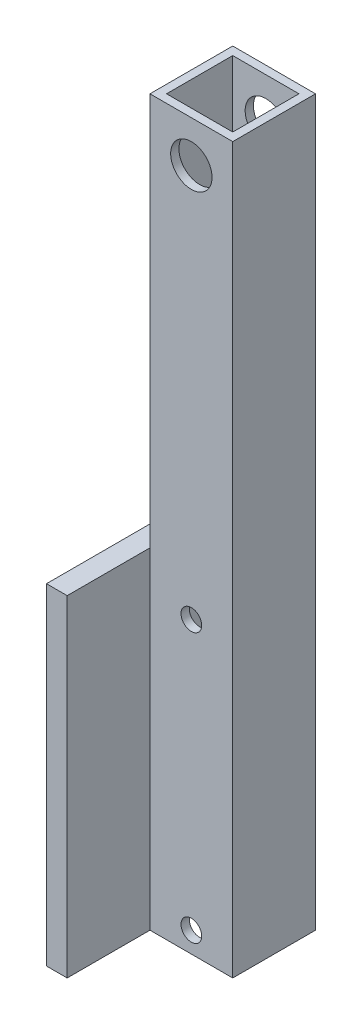
ISO-10303-21;
HEADER;
FILE_DESCRIPTION(('STEP AP214'),'2;1');
FILE_NAME('part.step','',(''),(''),'','','');
FILE_SCHEMA(('AUTOMOTIVE_DESIGN { 1 0 10303 214 1 1 1 1 }'));
ENDSEC;
DATA;
#1=APPLICATION_CONTEXT('core data for automotive mechanical design processes');
#2=APPLICATION_PROTOCOL_DEFINITION('international standard','automotive_design',2000,#1);
#3=PRODUCT_CONTEXT('',#1,'mechanical');
#4=PRODUCT('Part','Part','',(#3));
#5=PRODUCT_RELATED_PRODUCT_CATEGORY('part','',(#4));
#6=PRODUCT_DEFINITION_FORMATION('','',#4);
#7=PRODUCT_DEFINITION_CONTEXT('part definition',#1,'design');
#8=PRODUCT_DEFINITION('design','',#6,#7);
#9=PRODUCT_DEFINITION_SHAPE('','',#8);
#10=(LENGTH_UNIT() NAMED_UNIT(*) SI_UNIT(.MILLI.,.METRE.));
#11=(NAMED_UNIT(*) PLANE_ANGLE_UNIT() SI_UNIT($,.RADIAN.));
#12=(NAMED_UNIT(*) SI_UNIT($,.STERADIAN.) SOLID_ANGLE_UNIT());
#13=UNCERTAINTY_MEASURE_WITH_UNIT(LENGTH_MEASURE(1.E-05),#10,'distance_accuracy_value','');
#14=(GEOMETRIC_REPRESENTATION_CONTEXT(3) GLOBAL_UNCERTAINTY_ASSIGNED_CONTEXT((#13)) GLOBAL_UNIT_ASSIGNED_CONTEXT((#10,
#11,#12)) REPRESENTATION_CONTEXT('',''));
#15=CARTESIAN_POINT('',(0.,0.,0.));
#16=DIRECTION('',(0.,0.,1.));
#17=DIRECTION('',(1.,0.,0.));
#18=AXIS2_PLACEMENT_3D('',#15,#16,#17);
#19=CARTESIAN_POINT('',(-12.7,222.25,-12.7));
#20=DIRECTION('',(1.,0.,0.));
#21=DIRECTION('',(0.,0.,-1.));
#22=AXIS2_PLACEMENT_3D('',#19,#20,#21);
#23=PLANE('',#22);
#24=DIRECTION('',(0.,0.,-1.));
#25=VECTOR('',#24,1.);
#26=CARTESIAN_POINT('',(-12.7,101.6,-38.1));
#27=LINE('',#26,#25);
#28=CARTESIAN_POINT('',(-12.7,101.6,12.7));
#29=VERTEX_POINT('',#28);
#30=CARTESIAN_POINT('',(-12.7,101.6,-12.7));
#31=VERTEX_POINT('',#30);
#32=EDGE_CURVE('E11',#29,#31,#27,.T.);
#33=ORIENTED_EDGE('',*,*,#32,.F.);
#34=DIRECTION('',(0.,-1.,0.));
#35=VECTOR('',#34,1.);
#36=CARTESIAN_POINT('',(-12.7,222.25,12.7));
#37=LINE('',#36,#35);
#38=CARTESIAN_POINT('',(-12.7,222.25,12.7));
#39=VERTEX_POINT('',#38);
#40=EDGE_CURVE('E255',#39,#29,#37,.T.);
#41=ORIENTED_EDGE('',*,*,#40,.F.);
#42=DIRECTION('',(0.,0.,1.));
#43=VECTOR('',#42,1.);
#44=CARTESIAN_POINT('',(-12.7,222.25,-12.7));
#45=LINE('',#44,#43);
#46=CARTESIAN_POINT('',(-12.7,222.25,-12.7));
#47=VERTEX_POINT('',#46);
#48=EDGE_CURVE('E242',#47,#39,#45,.T.);
#49=ORIENTED_EDGE('',*,*,#48,.F.);
#50=DIRECTION('',(0.,-1.,0.));
#51=VECTOR('',#50,1.);
#52=CARTESIAN_POINT('',(-12.7,222.25,-12.7));
#53=LINE('',#52,#51);
#54=EDGE_CURVE('E258',#47,#31,#53,.T.);
#55=ORIENTED_EDGE('',*,*,#54,.T.);
#56=EDGE_LOOP('',(#33,#41,#49,#55));
#57=FACE_BOUND('',#56,.T.);
#58=ADVANCED_FACE('F47',(#57),#23,.F.);
#59=CARTESIAN_POINT('',(0.,222.25,0.));
#60=DIRECTION('',(0.,1.,0.));
#61=DIRECTION('',(0.,0.,1.));
#62=AXIS2_PLACEMENT_3D('',#59,#60,#61);
#63=PLANE('',#62);
#64=DIRECTION('',(0.,0.,-1.));
#65=VECTOR('',#64,1.);
#66=CARTESIAN_POINT('',(12.7,222.25,-12.7));
#67=LINE('',#66,#65);
#68=CARTESIAN_POINT('',(12.7,222.25,12.7));
#69=VERTEX_POINT('',#68);
#70=CARTESIAN_POINT('',(12.7,222.25,-12.7));
#71=VERTEX_POINT('',#70);
#72=EDGE_CURVE('E236',#69,#71,#67,.T.);
#73=ORIENTED_EDGE('',*,*,#72,.T.);
#74=DIRECTION('',(-1.,0.,0.));
#75=VECTOR('',#74,1.);
#76=CARTESIAN_POINT('',(-12.7,222.25,-12.7));
#77=LINE('',#76,#75);
#78=EDGE_CURVE('E239',#71,#47,#77,.T.);
#79=ORIENTED_EDGE('',*,*,#78,.T.);
#80=ORIENTED_EDGE('',*,*,#48,.T.);
#81=DIRECTION('',(1.,0.,0.));
#82=VECTOR('',#81,1.);
#83=CARTESIAN_POINT('',(-12.7,222.25,12.7));
#84=LINE('',#83,#82);
#85=EDGE_CURVE('E244',#39,#69,#84,.T.);
#86=ORIENTED_EDGE('',*,*,#85,.T.);
#87=EDGE_LOOP('',(#73,#79,#80,#86));
#88=FACE_BOUND('',#87,.T.);
#89=DIRECTION('',(1.,0.,0.));
#90=VECTOR('',#89,1.);
#91=CARTESIAN_POINT('',(-10.16,222.25,10.16));
#92=LINE('',#91,#90);
#93=CARTESIAN_POINT('',(-10.16,222.25,10.16));
#94=VERTEX_POINT('',#93);
#95=CARTESIAN_POINT('',(10.16,222.25,10.16));
#96=VERTEX_POINT('',#95);
#97=EDGE_CURVE('E209',#94,#96,#92,.T.);
#98=ORIENTED_EDGE('',*,*,#97,.F.);
#99=DIRECTION('',(0.,0.,1.));
#100=VECTOR('',#99,1.);
#101=CARTESIAN_POINT('',(-10.16,222.25,-10.16));
#102=LINE('',#101,#100);
#103=CARTESIAN_POINT('',(-10.16,222.25,-10.16));
#104=VERTEX_POINT('',#103);
#105=EDGE_CURVE('E207',#104,#94,#102,.T.);
#106=ORIENTED_EDGE('',*,*,#105,.F.);
#107=DIRECTION('',(-1.,0.,0.));
#108=VECTOR('',#107,1.);
#109=CARTESIAN_POINT('',(-10.16,222.25,-10.16));
#110=LINE('',#109,#108);
#111=CARTESIAN_POINT('',(10.16,222.25,-10.16));
#112=VERTEX_POINT('',#111);
#113=EDGE_CURVE('E214',#112,#104,#110,.T.);
#114=ORIENTED_EDGE('',*,*,#113,.F.);
#115=DIRECTION('',(0.,0.,-1.));
#116=VECTOR('',#115,1.);
#117=CARTESIAN_POINT('',(10.16,222.25,-10.16));
#118=LINE('',#117,#116);
#119=EDGE_CURVE('E212',#96,#112,#118,.T.);
#120=ORIENTED_EDGE('',*,*,#119,.F.);
#121=EDGE_LOOP('',(#98,#106,#114,#120));
#122=FACE_BOUND('',#121,.T.);
#123=ADVANCED_FACE('F286',(#88,#122),#63,.T.);
#124=CARTESIAN_POINT('',(0.,0.,0.));
#125=DIRECTION('',(0.,1.,0.));
#126=DIRECTION('',(0.,0.,1.));
#127=AXIS2_PLACEMENT_3D('',#124,#125,#126);
#128=PLANE('',#127);
#129=DIRECTION('',(0.,0.,-1.));
#130=VECTOR('',#129,1.);
#131=CARTESIAN_POINT('',(12.7,0.,-12.7));
#132=LINE('',#131,#130);
#133=CARTESIAN_POINT('',(12.7,0.,12.7));
#134=VERTEX_POINT('',#133);
#135=CARTESIAN_POINT('',(12.7,0.,-12.7));
#136=VERTEX_POINT('',#135);
#137=EDGE_CURVE('E235',#134,#136,#132,.T.);
#138=ORIENTED_EDGE('',*,*,#137,.F.);
#139=DIRECTION('',(1.,0.,0.));
#140=VECTOR('',#139,1.);
#141=CARTESIAN_POINT('',(-12.7,0.,12.7));
#142=LINE('',#141,#140);
#143=CARTESIAN_POINT('',(-12.7,0.,12.7));
#144=VERTEX_POINT('',#143);
#145=EDGE_CURVE('E240',#144,#134,#142,.T.);
#146=ORIENTED_EDGE('',*,*,#145,.F.);
#147=DIRECTION('',(0.,0.,1.));
#148=VECTOR('',#147,1.);
#149=CARTESIAN_POINT('',(-12.7,0.,-38.1));
#150=LINE('',#149,#148);
#151=CARTESIAN_POINT('',(-12.7,0.,38.1));
#152=VERTEX_POINT('',#151);
#153=EDGE_CURVE('E340',#144,#152,#150,.T.);
#154=ORIENTED_EDGE('',*,*,#153,.T.);
#155=DIRECTION('',(1.,0.,0.));
#156=VECTOR('',#155,1.);
#157=CARTESIAN_POINT('',(-19.05,0.,38.1));
#158=LINE('',#157,#156);
#159=CARTESIAN_POINT('',(-19.05,0.,38.1));
#160=VERTEX_POINT('',#159);
#161=EDGE_CURVE('E155',#160,#152,#158,.T.);
#162=ORIENTED_EDGE('',*,*,#161,.F.);
#163=DIRECTION('',(0.,0.,1.));
#164=VECTOR('',#163,1.);
#165=CARTESIAN_POINT('',(-19.05,0.,-38.1));
#166=LINE('',#165,#164);
#167=CARTESIAN_POINT('',(-19.05,0.,-38.1));
#168=VERTEX_POINT('',#167);
#169=EDGE_CURVE('E145',#168,#160,#166,.T.);
#170=ORIENTED_EDGE('',*,*,#169,.F.);
#171=DIRECTION('',(1.,0.,0.));
#172=VECTOR('',#171,1.);
#173=CARTESIAN_POINT('',(-19.05,0.,-38.1));
#174=LINE('',#173,#172);
#175=CARTESIAN_POINT('',(-12.7,0.,-38.1));
#176=VERTEX_POINT('',#175);
#177=EDGE_CURVE('E152',#168,#176,#174,.T.);
#178=ORIENTED_EDGE('',*,*,#177,.T.);
#179=CARTESIAN_POINT('',(-12.7,0.,-12.7));
#180=VERTEX_POINT('',#179);
#181=EDGE_CURVE('E338',#176,#180,#150,.T.);
#182=ORIENTED_EDGE('',*,*,#181,.T.);
#183=DIRECTION('',(-1.,0.,0.));
#184=VECTOR('',#183,1.);
#185=CARTESIAN_POINT('',(-12.7,0.,-12.7));
#186=LINE('',#185,#184);
#187=EDGE_CURVE('E249',#136,#180,#186,.T.);
#188=ORIENTED_EDGE('',*,*,#187,.F.);
#189=EDGE_LOOP('',(#138,#146,#154,#162,#170,#178,#182,#188));
#190=FACE_BOUND('',#189,.T.);
#191=DIRECTION('',(0.,0.,1.));
#192=VECTOR('',#191,1.);
#193=CARTESIAN_POINT('',(-10.16,0.,-10.16));
#194=LINE('',#193,#192);
#195=CARTESIAN_POINT('',(-10.16,0.,-10.16));
#196=VERTEX_POINT('',#195);
#197=CARTESIAN_POINT('',(-10.16,0.,10.16));
#198=VERTEX_POINT('',#197);
#199=EDGE_CURVE('E206',#196,#198,#194,.T.);
#200=ORIENTED_EDGE('',*,*,#199,.T.);
#201=DIRECTION('',(1.,0.,0.));
#202=VECTOR('',#201,1.);
#203=CARTESIAN_POINT('',(-10.16,0.,10.16));
#204=LINE('',#203,#202);
#205=CARTESIAN_POINT('',(10.16,0.,10.16));
#206=VERTEX_POINT('',#205);
#207=EDGE_CURVE('E219',#198,#206,#204,.T.);
#208=ORIENTED_EDGE('',*,*,#207,.T.);
#209=DIRECTION('',(0.,0.,-1.));
#210=VECTOR('',#209,1.);
#211=CARTESIAN_POINT('',(10.16,0.,-10.16));
#212=LINE('',#211,#210);
#213=CARTESIAN_POINT('',(10.16,0.,-10.16));
#214=VERTEX_POINT('',#213);
#215=EDGE_CURVE('E222',#206,#214,#212,.T.);
#216=ORIENTED_EDGE('',*,*,#215,.T.);
#217=DIRECTION('',(-1.,0.,0.));
#218=VECTOR('',#217,1.);
#219=CARTESIAN_POINT('',(-10.16,0.,-10.16));
#220=LINE('',#219,#218);
#221=EDGE_CURVE('E210',#214,#196,#220,.T.);
#222=ORIENTED_EDGE('',*,*,#221,.T.);
#223=EDGE_LOOP('',(#200,#208,#216,#222));
#224=FACE_BOUND('',#223,.T.);
#225=ADVANCED_FACE('F148',(#190,#224),#128,.F.);
#226=CARTESIAN_POINT('',(12.7,222.25,-12.7));
#227=DIRECTION('',(-1.,0.,0.));
#228=DIRECTION('',(0.,0.,1.));
#229=AXIS2_PLACEMENT_3D('',#226,#227,#228);
#230=PLANE('',#229);
#231=ORIENTED_EDGE('',*,*,#137,.T.);
#232=DIRECTION('',(0.,-1.,0.));
#233=VECTOR('',#232,1.);
#234=CARTESIAN_POINT('',(12.7,222.25,-12.7));
#235=LINE('',#234,#233);
#236=EDGE_CURVE('E56',#71,#136,#235,.T.);
#237=ORIENTED_EDGE('',*,*,#236,.F.);
#238=ORIENTED_EDGE('',*,*,#72,.F.);
#239=DIRECTION('',(0.,-1.,0.));
#240=VECTOR('',#239,1.);
#241=CARTESIAN_POINT('',(12.7,222.25,12.7));
#242=LINE('',#241,#240);
#243=EDGE_CURVE('E246',#69,#134,#242,.T.);
#244=ORIENTED_EDGE('',*,*,#243,.T.);
#245=EDGE_LOOP('',(#231,#237,#238,#244));
#246=FACE_BOUND('',#245,.T.);
#247=ADVANCED_FACE('F49',(#246),#230,.F.);
#248=CARTESIAN_POINT('',(-12.7,222.25,-12.7));
#249=DIRECTION('',(0.,0.,1.));
#250=DIRECTION('',(1.,0.,0.));
#251=AXIS2_PLACEMENT_3D('',#248,#249,#250);
#252=PLANE('',#251);
#253=CARTESIAN_POINT('',(0.,209.55,-12.7));
#254=DIRECTION('',(0.,0.,1.));
#255=DIRECTION('',(1.,0.,0.));
#256=AXIS2_PLACEMENT_3D('',#253,#254,#255);
#257=CIRCLE('',#256,6.35);
#258=CARTESIAN_POINT('',(6.35,209.55,-12.7));
#259=VERTEX_POINT('',#258);
#260=EDGE_CURVE('E203',#259,#259,#257,.T.);
#261=ORIENTED_EDGE('',*,*,#260,.T.);
#262=EDGE_LOOP('',(#261));
#263=FACE_BOUND('',#262,.T.);
#264=CARTESIAN_POINT('',(0.,6.34999999999999,-12.7));
#265=DIRECTION('',(0.,0.,1.));
#266=DIRECTION('',(1.,0.,0.));
#267=AXIS2_PLACEMENT_3D('',#264,#265,#266);
#268=CIRCLE('',#267,3.175);
#269=CARTESIAN_POINT('',(3.17500000000003,6.34999999999999,-12.7));
#270=VERTEX_POINT('',#269);
#271=EDGE_CURVE('E197',#270,#270,#268,.T.);
#272=ORIENTED_EDGE('',*,*,#271,.T.);
#273=EDGE_LOOP('',(#272));
#274=FACE_BOUND('',#273,.T.);
#275=CARTESIAN_POINT('',(0.,88.9,-12.7));
#276=DIRECTION('',(0.,0.,1.));
#277=DIRECTION('',(1.,0.,0.));
#278=AXIS2_PLACEMENT_3D('',#275,#276,#277);
#279=CIRCLE('',#278,3.175);
#280=CARTESIAN_POINT('',(3.17500000000002,88.9,-12.7));
#281=VERTEX_POINT('',#280);
#282=EDGE_CURVE('E190',#281,#281,#279,.T.);
#283=ORIENTED_EDGE('',*,*,#282,.T.);
#284=EDGE_LOOP('',(#283));
#285=FACE_BOUND('',#284,.T.);
#286=ORIENTED_EDGE('',*,*,#187,.T.);
#287=EDGE_CURVE('E257',#31,#180,#53,.T.);
#288=ORIENTED_EDGE('',*,*,#287,.F.);
#289=ORIENTED_EDGE('',*,*,#54,.F.);
#290=ORIENTED_EDGE('',*,*,#78,.F.);
#291=ORIENTED_EDGE('',*,*,#236,.T.);
#292=EDGE_LOOP('',(#286,#288,#289,#290,#291));
#293=FACE_BOUND('',#292,.T.);
#294=ADVANCED_FACE('F315',(#263,#274,#285,#293),#252,.F.);
#295=CARTESIAN_POINT('',(-12.7,222.25,12.7));
#296=DIRECTION('',(0.,0.,-1.));
#297=DIRECTION('',(-1.,0.,0.));
#298=AXIS2_PLACEMENT_3D('',#295,#296,#297);
#299=PLANE('',#298);
#300=CARTESIAN_POINT('',(0.,209.55,12.7));
#301=DIRECTION('',(0.,0.,1.));
#302=DIRECTION('',(1.,0.,0.));
#303=AXIS2_PLACEMENT_3D('',#300,#301,#302);
#304=CIRCLE('',#303,6.35);
#305=CARTESIAN_POINT('',(6.35,209.55,12.7));
#306=VERTEX_POINT('',#305);
#307=EDGE_CURVE('E181',#306,#306,#304,.T.);
#308=ORIENTED_EDGE('',*,*,#307,.F.);
#309=EDGE_LOOP('',(#308));
#310=FACE_BOUND('',#309,.T.);
#311=CARTESIAN_POINT('',(0.,6.34999999999999,12.7));
#312=DIRECTION('',(0.,0.,1.));
#313=DIRECTION('',(1.,0.,0.));
#314=AXIS2_PLACEMENT_3D('',#311,#312,#313);
#315=CIRCLE('',#314,3.175);
#316=CARTESIAN_POINT('',(3.17500000000003,6.34999999999999,12.7));
#317=VERTEX_POINT('',#316);
#318=EDGE_CURVE('E175',#317,#317,#315,.T.);
#319=ORIENTED_EDGE('',*,*,#318,.F.);
#320=EDGE_LOOP('',(#319));
#321=FACE_BOUND('',#320,.T.);
#322=CARTESIAN_POINT('',(0.,88.9,12.7));
#323=DIRECTION('',(0.,0.,1.));
#324=DIRECTION('',(1.,0.,0.));
#325=AXIS2_PLACEMENT_3D('',#322,#323,#324);
#326=CIRCLE('',#325,3.175);
#327=CARTESIAN_POINT('',(3.17500000000002,88.9,12.7));
#328=VERTEX_POINT('',#327);
#329=EDGE_CURVE('E172',#328,#328,#326,.T.);
#330=ORIENTED_EDGE('',*,*,#329,.F.);
#331=EDGE_LOOP('',(#330));
#332=FACE_BOUND('',#331,.T.);
#333=ORIENTED_EDGE('',*,*,#145,.T.);
#334=ORIENTED_EDGE('',*,*,#243,.F.);
#335=ORIENTED_EDGE('',*,*,#85,.F.);
#336=ORIENTED_EDGE('',*,*,#40,.T.);
#337=EDGE_CURVE('E254',#29,#144,#37,.T.);
#338=ORIENTED_EDGE('',*,*,#337,.T.);
#339=EDGE_LOOP('',(#333,#334,#335,#336,#338));
#340=FACE_BOUND('',#339,.T.);
#341=ADVANCED_FACE('F300',(#310,#321,#332,#340),#299,.F.);
#342=CARTESIAN_POINT('',(-10.16,222.25,-10.16));
#343=DIRECTION('',(1.,0.,0.));
#344=DIRECTION('',(0.,0.,-1.));
#345=AXIS2_PLACEMENT_3D('',#342,#343,#344);
#346=PLANE('',#345);
#347=ORIENTED_EDGE('',*,*,#199,.F.);
#348=DIRECTION('',(0.,-1.,0.));
#349=VECTOR('',#348,1.);
#350=CARTESIAN_POINT('',(-10.16,222.25,-10.16));
#351=LINE('',#350,#349);
#352=EDGE_CURVE('E216',#104,#196,#351,.T.);
#353=ORIENTED_EDGE('',*,*,#352,.F.);
#354=ORIENTED_EDGE('',*,*,#105,.T.);
#355=DIRECTION('',(0.,-1.,0.));
#356=VECTOR('',#355,1.);
#357=CARTESIAN_POINT('',(-10.16,222.25,10.16));
#358=LINE('',#357,#356);
#359=EDGE_CURVE('E232',#94,#198,#358,.T.);
#360=ORIENTED_EDGE('',*,*,#359,.T.);
#361=EDGE_LOOP('',(#347,#353,#354,#360));
#362=FACE_BOUND('',#361,.T.);
#363=ADVANCED_FACE('F288',(#362),#346,.T.);
#364=CARTESIAN_POINT('',(-10.16,222.25,10.16));
#365=DIRECTION('',(0.,0.,-1.));
#366=DIRECTION('',(-1.,0.,0.));
#367=AXIS2_PLACEMENT_3D('',#364,#365,#366);
#368=PLANE('',#367);
#369=CARTESIAN_POINT('',(0.,209.55,10.16));
#370=DIRECTION('',(0.,0.,-1.));
#371=DIRECTION('',(-1.,0.,0.));
#372=AXIS2_PLACEMENT_3D('',#369,#370,#371);
#373=CIRCLE('',#372,6.35);
#374=CARTESIAN_POINT('',(-6.35,209.55,10.16));
#375=VERTEX_POINT('',#374);
#376=EDGE_CURVE('E200',#375,#375,#373,.T.);
#377=ORIENTED_EDGE('',*,*,#376,.F.);
#378=EDGE_LOOP('',(#377));
#379=FACE_BOUND('',#378,.T.);
#380=CARTESIAN_POINT('',(0.,6.34999999999999,10.16));
#381=DIRECTION('',(0.,0.,-1.));
#382=DIRECTION('',(-1.,0.,0.));
#383=AXIS2_PLACEMENT_3D('',#380,#381,#382);
#384=CIRCLE('',#383,3.175);
#385=CARTESIAN_POINT('',(-3.17499999999997,6.34999999999999,10.16));
#386=VERTEX_POINT('',#385);
#387=EDGE_CURVE('E194',#386,#386,#384,.T.);
#388=ORIENTED_EDGE('',*,*,#387,.F.);
#389=EDGE_LOOP('',(#388));
#390=FACE_BOUND('',#389,.T.);
#391=CARTESIAN_POINT('',(0.,88.9,10.16));
#392=DIRECTION('',(0.,0.,-1.));
#393=DIRECTION('',(-1.,0.,0.));
#394=AXIS2_PLACEMENT_3D('',#391,#392,#393);
#395=CIRCLE('',#394,3.175);
#396=CARTESIAN_POINT('',(-3.17499999999998,88.9,10.16));
#397=VERTEX_POINT('',#396);
#398=EDGE_CURVE('E187',#397,#397,#395,.T.);
#399=ORIENTED_EDGE('',*,*,#398,.F.);
#400=EDGE_LOOP('',(#399));
#401=FACE_BOUND('',#400,.T.);
#402=ORIENTED_EDGE('',*,*,#207,.F.);
#403=ORIENTED_EDGE('',*,*,#359,.F.);
#404=ORIENTED_EDGE('',*,*,#97,.T.);
#405=DIRECTION('',(0.,-1.,0.));
#406=VECTOR('',#405,1.);
#407=CARTESIAN_POINT('',(10.16,222.25,10.16));
#408=LINE('',#407,#406);
#409=EDGE_CURVE('E230',#96,#206,#408,.T.);
#410=ORIENTED_EDGE('',*,*,#409,.T.);
#411=EDGE_LOOP('',(#402,#403,#404,#410));
#412=FACE_BOUND('',#411,.T.);
#413=ADVANCED_FACE('F291',(#379,#390,#401,#412),#368,.T.);
#414=CARTESIAN_POINT('',(10.16,222.25,-10.16));
#415=DIRECTION('',(-1.,0.,0.));
#416=DIRECTION('',(0.,0.,1.));
#417=AXIS2_PLACEMENT_3D('',#414,#415,#416);
#418=PLANE('',#417);
#419=ORIENTED_EDGE('',*,*,#215,.F.);
#420=ORIENTED_EDGE('',*,*,#409,.F.);
#421=ORIENTED_EDGE('',*,*,#119,.T.);
#422=DIRECTION('',(0.,-1.,0.));
#423=VECTOR('',#422,1.);
#424=CARTESIAN_POINT('',(10.16,222.25,-10.16));
#425=LINE('',#424,#423);
#426=EDGE_CURVE('E72',#112,#214,#425,.T.);
#427=ORIENTED_EDGE('',*,*,#426,.T.);
#428=EDGE_LOOP('',(#419,#420,#421,#427));
#429=FACE_BOUND('',#428,.T.);
#430=ADVANCED_FACE('F273',(#429),#418,.T.);
#431=CARTESIAN_POINT('',(-10.16,222.25,-10.16));
#432=DIRECTION('',(0.,0.,1.));
#433=DIRECTION('',(1.,0.,0.));
#434=AXIS2_PLACEMENT_3D('',#431,#432,#433);
#435=PLANE('',#434);
#436=CARTESIAN_POINT('',(0.,209.55,-10.16));
#437=DIRECTION('',(0.,0.,1.));
#438=DIRECTION('',(1.,0.,0.));
#439=AXIS2_PLACEMENT_3D('',#436,#437,#438);
#440=CIRCLE('',#439,6.35);
#441=CARTESIAN_POINT('',(6.35,209.55,-10.16));
#442=VERTEX_POINT('',#441);
#443=EDGE_CURVE('E51',#442,#442,#440,.T.);
#444=ORIENTED_EDGE('',*,*,#443,.F.);
#445=EDGE_LOOP('',(#444));
#446=FACE_BOUND('',#445,.T.);
#447=CARTESIAN_POINT('',(0.,6.34999999999999,-10.16));
#448=DIRECTION('',(0.,0.,1.));
#449=DIRECTION('',(1.,0.,0.));
#450=AXIS2_PLACEMENT_3D('',#447,#448,#449);
#451=CIRCLE('',#450,3.175);
#452=CARTESIAN_POINT('',(3.17500000000003,6.34999999999999,-10.16));
#453=VERTEX_POINT('',#452);
#454=EDGE_CURVE('E193',#453,#453,#451,.T.);
#455=ORIENTED_EDGE('',*,*,#454,.F.);
#456=EDGE_LOOP('',(#455));
#457=FACE_BOUND('',#456,.T.);
#458=CARTESIAN_POINT('',(0.,88.9,-10.16));
#459=DIRECTION('',(0.,0.,1.));
#460=DIRECTION('',(1.,0.,0.));
#461=AXIS2_PLACEMENT_3D('',#458,#459,#460);
#462=CIRCLE('',#461,3.175);
#463=CARTESIAN_POINT('',(3.17500000000002,88.9,-10.16));
#464=VERTEX_POINT('',#463);
#465=EDGE_CURVE('E184',#464,#464,#462,.T.);
#466=ORIENTED_EDGE('',*,*,#465,.F.);
#467=EDGE_LOOP('',(#466));
#468=FACE_BOUND('',#467,.T.);
#469=ORIENTED_EDGE('',*,*,#221,.F.);
#470=ORIENTED_EDGE('',*,*,#426,.F.);
#471=ORIENTED_EDGE('',*,*,#113,.T.);
#472=ORIENTED_EDGE('',*,*,#352,.T.);
#473=EDGE_LOOP('',(#469,#470,#471,#472));
#474=FACE_BOUND('',#473,.T.);
#475=ADVANCED_FACE('F269',(#446,#457,#468,#474),#435,.T.);
#476=CARTESIAN_POINT('',(0.,88.9,-209.55));
#477=DIRECTION('',(0.,0.,1.));
#478=DIRECTION('',(1.,0.,0.));
#479=AXIS2_PLACEMENT_3D('',#476,#477,#478);
#480=CYLINDRICAL_SURFACE('',#479,3.175);
#481=ORIENTED_EDGE('',*,*,#465,.T.);
#482=EDGE_LOOP('',(#481));
#483=FACE_BOUND('',#482,.T.);
#484=ORIENTED_EDGE('',*,*,#282,.F.);
#485=EDGE_LOOP('',(#484));
#486=FACE_BOUND('',#485,.T.);
#487=ADVANCED_FACE('F272',(#483,#486),#480,.F.);
#488=CARTESIAN_POINT('',(0.,6.34999999999999,-209.55));
#489=DIRECTION('',(0.,0.,1.));
#490=DIRECTION('',(1.,0.,0.));
#491=AXIS2_PLACEMENT_3D('',#488,#489,#490);
#492=CYLINDRICAL_SURFACE('',#491,3.175);
#493=ORIENTED_EDGE('',*,*,#454,.T.);
#494=EDGE_LOOP('',(#493));
#495=FACE_BOUND('',#494,.T.);
#496=ORIENTED_EDGE('',*,*,#271,.F.);
#497=EDGE_LOOP('',(#496));
#498=FACE_BOUND('',#497,.T.);
#499=ADVANCED_FACE('F266',(#495,#498),#492,.F.);
#500=CARTESIAN_POINT('',(0.,209.55,-209.55));
#501=DIRECTION('',(0.,0.,1.));
#502=DIRECTION('',(1.,0.,0.));
#503=AXIS2_PLACEMENT_3D('',#500,#501,#502);
#504=CYLINDRICAL_SURFACE('',#503,6.35);
#505=ORIENTED_EDGE('',*,*,#443,.T.);
#506=EDGE_LOOP('',(#505));
#507=FACE_BOUND('',#506,.T.);
#508=ORIENTED_EDGE('',*,*,#260,.F.);
#509=EDGE_LOOP('',(#508));
#510=FACE_BOUND('',#509,.T.);
#511=ADVANCED_FACE('F377',(#507,#510),#504,.F.);
#512=ORIENTED_EDGE('',*,*,#398,.T.);
#513=EDGE_LOOP('',(#512));
#514=FACE_BOUND('',#513,.T.);
#515=ORIENTED_EDGE('',*,*,#329,.T.);
#516=EDGE_LOOP('',(#515));
#517=FACE_BOUND('',#516,.T.);
#518=ADVANCED_FACE('F380',(#514,#517),#480,.F.);
#519=ORIENTED_EDGE('',*,*,#387,.T.);
#520=EDGE_LOOP('',(#519));
#521=FACE_BOUND('',#520,.T.);
#522=ORIENTED_EDGE('',*,*,#318,.T.);
#523=EDGE_LOOP('',(#522));
#524=FACE_BOUND('',#523,.T.);
#525=ADVANCED_FACE('F385',(#521,#524),#492,.F.);
#526=ORIENTED_EDGE('',*,*,#376,.T.);
#527=EDGE_LOOP('',(#526));
#528=FACE_BOUND('',#527,.T.);
#529=ORIENTED_EDGE('',*,*,#307,.T.);
#530=EDGE_LOOP('',(#529));
#531=FACE_BOUND('',#530,.T.);
#532=ADVANCED_FACE('F382',(#528,#531),#504,.F.);
#533=CARTESIAN_POINT('',(-12.7,0.,0.));
#534=DIRECTION('',(-1.,0.,0.));
#535=DIRECTION('',(0.,0.,1.));
#536=AXIS2_PLACEMENT_3D('',#533,#534,#535);
#537=PLANE('',#536);
#538=CARTESIAN_POINT('',(-12.7,101.6,-38.1));
#539=VERTEX_POINT('',#538);
#540=EDGE_CURVE('E59',#31,#539,#27,.T.);
#541=ORIENTED_EDGE('',*,*,#540,.F.);
#542=ORIENTED_EDGE('',*,*,#287,.T.);
#543=ORIENTED_EDGE('',*,*,#181,.F.);
#544=DIRECTION('',(0.,-1.,0.));
#545=VECTOR('',#544,1.);
#546=CARTESIAN_POINT('',(-12.7,101.6,-38.1));
#547=LINE('',#546,#545);
#548=EDGE_CURVE('E171',#539,#176,#547,.T.);
#549=ORIENTED_EDGE('',*,*,#548,.F.);
#550=EDGE_LOOP('',(#541,#542,#543,#549));
#551=FACE_BOUND('',#550,.T.);
#552=ADVANCED_FACE('F337',(#551),#537,.F.);
#553=CARTESIAN_POINT('',(-19.05,101.6,-38.1));
#554=DIRECTION('',(0.,0.,1.));
#555=DIRECTION('',(1.,0.,0.));
#556=AXIS2_PLACEMENT_3D('',#553,#554,#555);
#557=PLANE('',#556);
#558=ORIENTED_EDGE('',*,*,#548,.T.);
#559=ORIENTED_EDGE('',*,*,#177,.F.);
#560=DIRECTION('',(0.,-1.,0.));
#561=VECTOR('',#560,1.);
#562=CARTESIAN_POINT('',(-19.05,101.6,-38.1));
#563=LINE('',#562,#561);
#564=CARTESIAN_POINT('',(-19.05,101.6,-38.1));
#565=VERTEX_POINT('',#564);
#566=EDGE_CURVE('E159',#565,#168,#563,.T.);
#567=ORIENTED_EDGE('',*,*,#566,.F.);
#568=DIRECTION('',(1.,0.,0.));
#569=VECTOR('',#568,1.);
#570=CARTESIAN_POINT('',(-19.05,101.6,-38.1));
#571=LINE('',#570,#569);
#572=EDGE_CURVE('E347',#565,#539,#571,.T.);
#573=ORIENTED_EDGE('',*,*,#572,.T.);
#574=EDGE_LOOP('',(#558,#559,#567,#573));
#575=FACE_BOUND('',#574,.T.);
#576=ADVANCED_FACE('F169',(#575),#557,.F.);
#577=CARTESIAN_POINT('',(-19.05,0.,38.1));
#578=DIRECTION('',(0.,0.,-1.));
#579=DIRECTION('',(-1.,0.,0.));
#580=AXIS2_PLACEMENT_3D('',#577,#578,#579);
#581=PLANE('',#580);
#582=DIRECTION('',(0.,1.,0.));
#583=VECTOR('',#582,1.);
#584=CARTESIAN_POINT('',(-12.7,0.,38.1));
#585=LINE('',#584,#583);
#586=CARTESIAN_POINT('',(-12.7,101.6,38.1));
#587=VERTEX_POINT('',#586);
#588=EDGE_CURVE('E339',#152,#587,#585,.T.);
#589=ORIENTED_EDGE('',*,*,#588,.T.);
#590=DIRECTION('',(1.,0.,0.));
#591=VECTOR('',#590,1.);
#592=CARTESIAN_POINT('',(-19.05,101.6,38.1));
#593=LINE('',#592,#591);
#594=CARTESIAN_POINT('',(-19.05,101.6,38.1));
#595=VERTEX_POINT('',#594);
#596=EDGE_CURVE('E177',#595,#587,#593,.T.);
#597=ORIENTED_EDGE('',*,*,#596,.F.);
#598=DIRECTION('',(0.,1.,0.));
#599=VECTOR('',#598,1.);
#600=CARTESIAN_POINT('',(-19.05,0.,38.1));
#601=LINE('',#600,#599);
#602=EDGE_CURVE('E158',#160,#595,#601,.T.);
#603=ORIENTED_EDGE('',*,*,#602,.F.);
#604=ORIENTED_EDGE('',*,*,#161,.T.);
#605=EDGE_LOOP('',(#589,#597,#603,#604));
#606=FACE_BOUND('',#605,.T.);
#607=ADVANCED_FACE('F365',(#606),#581,.F.);
#608=CARTESIAN_POINT('',(-19.05,101.6,-38.1));
#609=DIRECTION('',(0.,-1.,0.));
#610=DIRECTION('',(0.,0.,-1.));
#611=AXIS2_PLACEMENT_3D('',#608,#609,#610);
#612=PLANE('',#611);
#613=EDGE_CURVE('E58',#587,#29,#27,.T.);
#614=ORIENTED_EDGE('',*,*,#613,.T.);
#615=ORIENTED_EDGE('',*,*,#32,.T.);
#616=ORIENTED_EDGE('',*,*,#540,.T.);
#617=ORIENTED_EDGE('',*,*,#572,.F.);
#618=DIRECTION('',(0.,0.,-1.));
#619=VECTOR('',#618,1.);
#620=CARTESIAN_POINT('',(-19.05,101.6,-38.1));
#621=LINE('',#620,#619);
#622=EDGE_CURVE('E164',#595,#565,#621,.T.);
#623=ORIENTED_EDGE('',*,*,#622,.F.);
#624=ORIENTED_EDGE('',*,*,#596,.T.);
#625=EDGE_LOOP('',(#614,#615,#616,#617,#623,#624));
#626=FACE_BOUND('',#625,.T.);
#627=ADVANCED_FACE('F352',(#626),#612,.F.);
#628=CARTESIAN_POINT('',(-19.05,0.,0.));
#629=DIRECTION('',(-1.,0.,0.));
#630=DIRECTION('',(0.,0.,1.));
#631=AXIS2_PLACEMENT_3D('',#628,#629,#630);
#632=PLANE('',#631);
#633=ORIENTED_EDGE('',*,*,#566,.T.);
#634=ORIENTED_EDGE('',*,*,#169,.T.);
#635=ORIENTED_EDGE('',*,*,#602,.T.);
#636=ORIENTED_EDGE('',*,*,#622,.T.);
#637=EDGE_LOOP('',(#633,#634,#635,#636));
#638=FACE_BOUND('',#637,.T.);
#639=ADVANCED_FACE('F162',(#638),#632,.T.);
#640=ORIENTED_EDGE('',*,*,#337,.F.);
#641=ORIENTED_EDGE('',*,*,#613,.F.);
#642=ORIENTED_EDGE('',*,*,#588,.F.);
#643=ORIENTED_EDGE('',*,*,#153,.F.);
#644=EDGE_LOOP('',(#640,#641,#642,#643));
#645=FACE_BOUND('',#644,.T.);
#646=ADVANCED_FACE('F357',(#645),#537,.F.);
#647=CLOSED_SHELL('',(#58,#123,#225,#247,#294,#341,#363,#413,#430,#475,#487,#499,#511,#518,#525,
#532,#552,#576,#607,#627,#639,#646));
#648=MANIFOLD_SOLID_BREP('B2',#647);
#649=ADVANCED_BREP_SHAPE_REPRESENTATION('',(#18,#648),#14);
#650=SHAPE_DEFINITION_REPRESENTATION(#9,#649);
ENDSEC;
END-ISO-10303-21;
